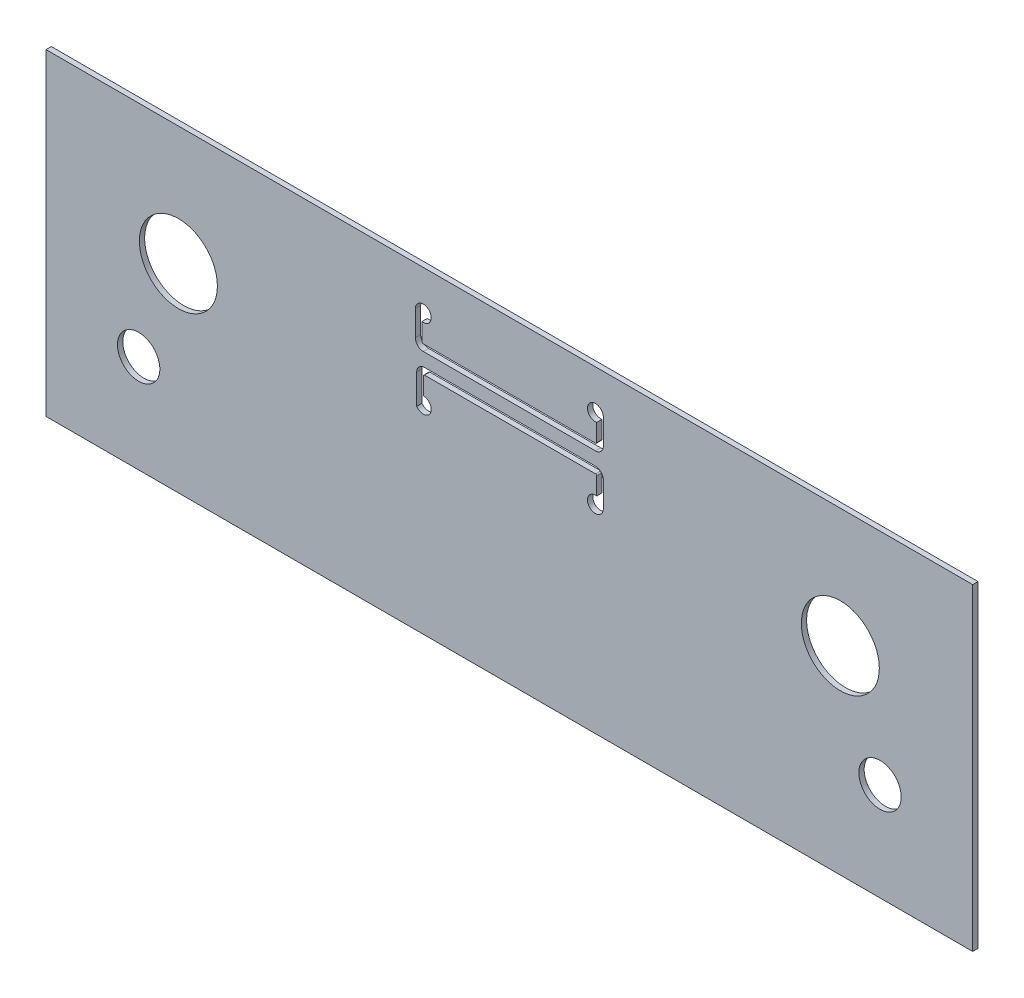
ISO-10303-21;
HEADER;
FILE_DESCRIPTION(('STEP AP214'),'2;1');
FILE_NAME('part.step','',(''),(''),'','','');
FILE_SCHEMA(('AUTOMOTIVE_DESIGN { 1 0 10303 214 1 1 1 1 }'));
ENDSEC;
DATA;
#1=APPLICATION_CONTEXT('core data for automotive mechanical design processes');
#2=APPLICATION_PROTOCOL_DEFINITION('international standard','automotive_design',2000,#1);
#3=PRODUCT_CONTEXT('',#1,'mechanical');
#4=PRODUCT('Part','Part','',(#3));
#5=PRODUCT_RELATED_PRODUCT_CATEGORY('part','',(#4));
#6=PRODUCT_DEFINITION_FORMATION('','',#4);
#7=PRODUCT_DEFINITION_CONTEXT('part definition',#1,'design');
#8=PRODUCT_DEFINITION('design','',#6,#7);
#9=PRODUCT_DEFINITION_SHAPE('','',#8);
#10=(LENGTH_UNIT() NAMED_UNIT(*) SI_UNIT(.MILLI.,.METRE.));
#11=(NAMED_UNIT(*) PLANE_ANGLE_UNIT() SI_UNIT($,.RADIAN.));
#12=(NAMED_UNIT(*) SI_UNIT($,.STERADIAN.) SOLID_ANGLE_UNIT());
#13=UNCERTAINTY_MEASURE_WITH_UNIT(LENGTH_MEASURE(1.E-05),#10,'distance_accuracy_value','');
#14=(GEOMETRIC_REPRESENTATION_CONTEXT(3) GLOBAL_UNCERTAINTY_ASSIGNED_CONTEXT((#13)) GLOBAL_UNIT_ASSIGNED_CONTEXT((#10,
#11,#12)) REPRESENTATION_CONTEXT('',''));
#15=CARTESIAN_POINT('',(0.,0.,0.));
#16=DIRECTION('',(0.,0.,1.));
#17=DIRECTION('',(1.,0.,0.));
#18=AXIS2_PLACEMENT_3D('',#15,#16,#17);
#19=CARTESIAN_POINT('',(0.,0.,0.2));
#20=DIRECTION('',(0.,0.,-1.));
#21=DIRECTION('',(-1.,0.,0.));
#22=AXIS2_PLACEMENT_3D('',#19,#20,#21);
#23=PLANE('',#22);
#24=CARTESIAN_POINT('',(30.,-4.5,0.2));
#25=DIRECTION('',(0.,0.,1.));
#26=DIRECTION('',(1.,0.,0.));
#27=AXIS2_PLACEMENT_3D('',#24,#25,#26);
#28=CIRCLE('',#27,1.4732);
#29=CARTESIAN_POINT('',(31.4732,-4.5,0.2));
#30=VERTEX_POINT('',#29);
#31=EDGE_CURVE('E266',#30,#30,#28,.T.);
#32=ORIENTED_EDGE('',*,*,#31,.F.);
#33=EDGE_LOOP('',(#32));
#34=FACE_BOUND('',#33,.T.);
#35=CARTESIAN_POINT('',(14.25,-4.5,0.2));
#36=DIRECTION('',(0.,0.,1.));
#37=DIRECTION('',(1.,0.,0.));
#38=AXIS2_PLACEMENT_3D('',#35,#36,#37);
#39=CIRCLE('',#38,0.3);
#40=CARTESIAN_POINT('',(14.,-4.66583123951777,0.2));
#41=VERTEX_POINT('',#40);
#42=CARTESIAN_POINT('',(14.25,-4.2,0.2));
#43=VERTEX_POINT('',#42);
#44=EDGE_CURVE('E316',#41,#43,#39,.T.);
#45=ORIENTED_EDGE('',*,*,#44,.F.);
#46=DIRECTION('',(0.,-1.,0.));
#47=VECTOR('',#46,1.);
#48=CARTESIAN_POINT('',(14.,-3.55,0.2));
#49=LINE('',#48,#47);
#50=CARTESIAN_POINT('',(14.,-3.55,0.2));
#51=VERTEX_POINT('',#50);
#52=EDGE_CURVE('E340',#51,#41,#49,.T.);
#53=ORIENTED_EDGE('',*,*,#52,.F.);
#54=CARTESIAN_POINT('',(14.3,-3.55,0.2));
#55=DIRECTION('',(0.,0.,1.));
#56=DIRECTION('',(1.,0.,0.));
#57=AXIS2_PLACEMENT_3D('',#54,#55,#56);
#58=CIRCLE('',#57,0.299999999999999);
#59=CARTESIAN_POINT('',(14.3,-3.25,0.2));
#60=VERTEX_POINT('',#59);
#61=EDGE_CURVE('E337',#60,#51,#58,.T.);
#62=ORIENTED_EDGE('',*,*,#61,.F.);
#63=DIRECTION('',(-1.,0.,0.));
#64=VECTOR('',#63,1.);
#65=CARTESIAN_POINT('',(20.75,-3.25,0.2));
#66=LINE('',#65,#64);
#67=CARTESIAN_POINT('',(20.75,-3.25,0.2));
#68=VERTEX_POINT('',#67);
#69=EDGE_CURVE('E335',#68,#60,#66,.T.);
#70=ORIENTED_EDGE('',*,*,#69,.F.);
#71=CARTESIAN_POINT('',(20.75,-3.55,0.2));
#72=DIRECTION('',(0.,0.,1.));
#73=DIRECTION('',(1.,0.,0.));
#74=AXIS2_PLACEMENT_3D('',#71,#72,#73);
#75=CIRCLE('',#74,0.300000000000001);
#76=CARTESIAN_POINT('',(21.05,-3.55,0.2));
#77=VERTEX_POINT('',#76);
#78=EDGE_CURVE('E333',#77,#68,#75,.T.);
#79=ORIENTED_EDGE('',*,*,#78,.F.);
#80=DIRECTION('',(0.,1.,0.));
#81=VECTOR('',#80,1.);
#82=CARTESIAN_POINT('',(21.05,-4.5,0.2));
#83=LINE('',#82,#81);
#84=CARTESIAN_POINT('',(21.05,-4.5,0.2));
#85=VERTEX_POINT('',#84);
#86=EDGE_CURVE('E331',#85,#77,#83,.T.);
#87=ORIENTED_EDGE('',*,*,#86,.F.);
#88=CARTESIAN_POINT('',(20.75,-4.5,0.2));
#89=DIRECTION('',(0.,0.,1.));
#90=DIRECTION('',(1.,0.,0.));
#91=AXIS2_PLACEMENT_3D('',#88,#89,#90);
#92=CIRCLE('',#91,0.300000000000001);
#93=CARTESIAN_POINT('',(20.8,-4.20419601084502,0.2));
#94=VERTEX_POINT('',#93);
#95=EDGE_CURVE('E329',#94,#85,#92,.T.);
#96=ORIENTED_EDGE('',*,*,#95,.F.);
#97=DIRECTION('',(0.,-1.,0.));
#98=VECTOR('',#97,1.);
#99=CARTESIAN_POINT('',(20.8,-3.55,0.2));
#100=LINE('',#99,#98);
#101=CARTESIAN_POINT('',(20.8,-3.55,0.2));
#102=VERTEX_POINT('',#101);
#103=EDGE_CURVE('E327',#102,#94,#100,.T.);
#104=ORIENTED_EDGE('',*,*,#103,.F.);
#105=CARTESIAN_POINT('',(20.75,-3.55,0.2));
#106=DIRECTION('',(0.,0.,-1.));
#107=DIRECTION('',(-1.,0.,0.));
#108=AXIS2_PLACEMENT_3D('',#105,#106,#107);
#109=CIRCLE('',#108,0.0499999999999982);
#110=CARTESIAN_POINT('',(20.75,-3.5,0.2));
#111=VERTEX_POINT('',#110);
#112=EDGE_CURVE('E325',#111,#102,#109,.T.);
#113=ORIENTED_EDGE('',*,*,#112,.F.);
#114=DIRECTION('',(1.,0.,0.));
#115=VECTOR('',#114,1.);
#116=CARTESIAN_POINT('',(14.3,-3.5,0.2));
#117=LINE('',#116,#115);
#118=CARTESIAN_POINT('',(14.3,-3.5,0.2));
#119=VERTEX_POINT('',#118);
#120=EDGE_CURVE('E323',#119,#111,#117,.T.);
#121=ORIENTED_EDGE('',*,*,#120,.F.);
#122=CARTESIAN_POINT('',(14.3,-3.55,0.2));
#123=DIRECTION('',(0.,0.,-1.));
#124=DIRECTION('',(-1.,0.,0.));
#125=AXIS2_PLACEMENT_3D('',#122,#123,#124);
#126=CIRCLE('',#125,0.0500000000000006);
#127=CARTESIAN_POINT('',(14.25,-3.55,0.2));
#128=VERTEX_POINT('',#127);
#129=EDGE_CURVE('E321',#128,#119,#126,.T.);
#130=ORIENTED_EDGE('',*,*,#129,.F.);
#131=DIRECTION('',(0.,1.,0.));
#132=VECTOR('',#131,1.);
#133=CARTESIAN_POINT('',(14.25,-4.2,0.2));
#134=LINE('',#133,#132);
#135=EDGE_CURVE('E318',#43,#128,#134,.T.);
#136=ORIENTED_EDGE('',*,*,#135,.F.);
#137=EDGE_LOOP('',(#45,#53,#62,#70,#79,#87,#96,#104,#113,#121,#130,#136));
#138=FACE_BOUND('',#137,.T.);
#139=CARTESIAN_POINT('',(3.5,-8.3,0.2));
#140=DIRECTION('',(0.,0.,1.));
#141=DIRECTION('',(1.,0.,0.));
#142=AXIS2_PLACEMENT_3D('',#139,#140,#141);
#143=CIRCLE('',#142,0.800099999999999);
#144=CARTESIAN_POINT('',(4.3001,-8.3,0.2));
#145=VERTEX_POINT('',#144);
#146=EDGE_CURVE('E409',#145,#145,#143,.T.);
#147=ORIENTED_EDGE('',*,*,#146,.F.);
#148=EDGE_LOOP('',(#147));
#149=FACE_BOUND('',#148,.T.);
#150=DIRECTION('',(0.,-1.,0.));
#151=VECTOR('',#150,1.);
#152=CARTESIAN_POINT('',(0.,-12.,0.2));
#153=LINE('',#152,#151);
#154=CARTESIAN_POINT('',(0.,0.,0.2));
#155=VERTEX_POINT('',#154);
#156=CARTESIAN_POINT('',(0.,-12.,0.2));
#157=VERTEX_POINT('',#156);
#158=EDGE_CURVE('E415',#155,#157,#153,.T.);
#159=ORIENTED_EDGE('',*,*,#158,.T.);
#160=DIRECTION('',(1.,0.,0.));
#161=VECTOR('',#160,1.);
#162=CARTESIAN_POINT('',(35.,-12.,0.2));
#163=LINE('',#162,#161);
#164=CARTESIAN_POINT('',(35.,-12.,0.2));
#165=VERTEX_POINT('',#164);
#166=EDGE_CURVE('E418',#157,#165,#163,.T.);
#167=ORIENTED_EDGE('',*,*,#166,.T.);
#168=DIRECTION('',(0.,1.,0.));
#169=VECTOR('',#168,1.);
#170=CARTESIAN_POINT('',(35.,0.,0.2));
#171=LINE('',#170,#169);
#172=CARTESIAN_POINT('',(35.,0.,0.2));
#173=VERTEX_POINT('',#172);
#174=EDGE_CURVE('E421',#165,#173,#171,.T.);
#175=ORIENTED_EDGE('',*,*,#174,.T.);
#176=DIRECTION('',(-1.,0.,0.));
#177=VECTOR('',#176,1.);
#178=CARTESIAN_POINT('',(0.,0.,0.2));
#179=LINE('',#178,#177);
#180=EDGE_CURVE('E423',#173,#155,#179,.T.);
#181=ORIENTED_EDGE('',*,*,#180,.T.);
#182=EDGE_LOOP('',(#159,#167,#175,#181));
#183=FACE_BOUND('',#182,.T.);
#184=CARTESIAN_POINT('',(5.,-4.5,0.2));
#185=DIRECTION('',(0.,0.,1.));
#186=DIRECTION('',(1.,0.,0.));
#187=AXIS2_PLACEMENT_3D('',#184,#185,#186);
#188=CIRCLE('',#187,1.4732);
#189=CARTESIAN_POINT('',(6.4732,-4.5,0.2));
#190=VERTEX_POINT('',#189);
#191=EDGE_CURVE('E403',#190,#190,#188,.T.);
#192=ORIENTED_EDGE('',*,*,#191,.F.);
#193=EDGE_LOOP('',(#192));
#194=FACE_BOUND('',#193,.T.);
#195=CARTESIAN_POINT('',(14.25,-2.45,0.2));
#196=DIRECTION('',(0.,0.,-1.));
#197=DIRECTION('',(1.,0.,0.));
#198=AXIS2_PLACEMENT_3D('',#195,#196,#197);
#199=CIRCLE('',#198,0.0499999999999997);
#200=CARTESIAN_POINT('',(14.25,-2.5,0.2));
#201=VERTEX_POINT('',#200);
#202=CARTESIAN_POINT('',(14.2,-2.45,0.2));
#203=VERTEX_POINT('',#202);
#204=EDGE_CURVE('E220',#201,#203,#199,.T.);
#205=ORIENTED_EDGE('',*,*,#204,.F.);
#206=DIRECTION('',(-1.,0.,0.));
#207=VECTOR('',#206,1.);
#208=CARTESIAN_POINT('',(14.25,-2.5,0.2));
#209=LINE('',#208,#207);
#210=CARTESIAN_POINT('',(20.75,-2.5,0.2));
#211=VERTEX_POINT('',#210);
#212=EDGE_CURVE('E263',#211,#201,#209,.T.);
#213=ORIENTED_EDGE('',*,*,#212,.F.);
#214=CARTESIAN_POINT('',(20.75,-2.45,0.2));
#215=DIRECTION('',(0.,0.,-1.));
#216=DIRECTION('',(1.,0.,0.));
#217=AXIS2_PLACEMENT_3D('',#214,#215,#216);
#218=CIRCLE('',#217,0.0499999999999988);
#219=CARTESIAN_POINT('',(20.8,-2.45,0.2));
#220=VERTEX_POINT('',#219);
#221=EDGE_CURVE('E261',#220,#211,#218,.T.);
#222=ORIENTED_EDGE('',*,*,#221,.F.);
#223=DIRECTION('',(0.,-1.,0.));
#224=VECTOR('',#223,1.);
#225=CARTESIAN_POINT('',(20.8,-2.45,0.2));
#226=LINE('',#225,#224);
#227=CARTESIAN_POINT('',(20.8,-1.79580398915498,0.2));
#228=VERTEX_POINT('',#227);
#229=EDGE_CURVE('E259',#228,#220,#226,.T.);
#230=ORIENTED_EDGE('',*,*,#229,.F.);
#231=CARTESIAN_POINT('',(20.75,-1.5,0.2));
#232=DIRECTION('',(0.,0.,1.));
#233=DIRECTION('',(1.,0.,0.));
#234=AXIS2_PLACEMENT_3D('',#231,#232,#233);
#235=CIRCLE('',#234,0.300000000000001);
#236=CARTESIAN_POINT('',(21.05,-1.5,0.2));
#237=VERTEX_POINT('',#236);
#238=EDGE_CURVE('E257',#237,#228,#235,.T.);
#239=ORIENTED_EDGE('',*,*,#238,.F.);
#240=DIRECTION('',(0.,1.,0.));
#241=VECTOR('',#240,1.);
#242=CARTESIAN_POINT('',(21.05,-2.45,0.2));
#243=LINE('',#242,#241);
#244=CARTESIAN_POINT('',(21.05,-2.45,0.2));
#245=VERTEX_POINT('',#244);
#246=EDGE_CURVE('E255',#245,#237,#243,.T.);
#247=ORIENTED_EDGE('',*,*,#246,.F.);
#248=CARTESIAN_POINT('',(20.75,-2.45,0.2));
#249=DIRECTION('',(0.,0.,1.));
#250=DIRECTION('',(1.,0.,0.));
#251=AXIS2_PLACEMENT_3D('',#248,#249,#250);
#252=CIRCLE('',#251,0.299999999999999);
#253=CARTESIAN_POINT('',(20.75,-2.75,0.2));
#254=VERTEX_POINT('',#253);
#255=EDGE_CURVE('E253',#254,#245,#252,.T.);
#256=ORIENTED_EDGE('',*,*,#255,.F.);
#257=DIRECTION('',(1.,0.,0.));
#258=VECTOR('',#257,1.);
#259=CARTESIAN_POINT('',(14.25,-2.75,0.2));
#260=LINE('',#259,#258);
#261=CARTESIAN_POINT('',(14.25,-2.75,0.2));
#262=VERTEX_POINT('',#261);
#263=EDGE_CURVE('E251',#262,#254,#260,.T.);
#264=ORIENTED_EDGE('',*,*,#263,.F.);
#265=CARTESIAN_POINT('',(14.25,-2.45,0.2));
#266=DIRECTION('',(0.,0.,1.));
#267=DIRECTION('',(1.,0.,0.));
#268=AXIS2_PLACEMENT_3D('',#265,#266,#267);
#269=CIRCLE('',#268,0.3);
#270=CARTESIAN_POINT('',(13.95,-2.45,0.2));
#271=VERTEX_POINT('',#270);
#272=EDGE_CURVE('E249',#271,#262,#269,.T.);
#273=ORIENTED_EDGE('',*,*,#272,.F.);
#274=DIRECTION('',(0.,-1.,0.));
#275=VECTOR('',#274,1.);
#276=CARTESIAN_POINT('',(13.95,-1.5,0.2));
#277=LINE('',#276,#275);
#278=CARTESIAN_POINT('',(13.95,-1.5,0.2));
#279=VERTEX_POINT('',#278);
#280=EDGE_CURVE('E244',#279,#271,#277,.T.);
#281=ORIENTED_EDGE('',*,*,#280,.F.);
#282=CARTESIAN_POINT('',(14.25,-1.5,0.2));
#283=DIRECTION('',(0.,0.,1.));
#284=DIRECTION('',(1.,0.,0.));
#285=AXIS2_PLACEMENT_3D('',#282,#283,#284);
#286=CIRCLE('',#285,0.300000000000001);
#287=CARTESIAN_POINT('',(14.2,-1.79580398915498,0.2));
#288=VERTEX_POINT('',#287);
#289=EDGE_CURVE('E242',#288,#279,#286,.T.);
#290=ORIENTED_EDGE('',*,*,#289,.F.);
#291=DIRECTION('',(0.,1.,0.));
#292=VECTOR('',#291,1.);
#293=CARTESIAN_POINT('',(14.2,-1.79580398915498,0.2));
#294=LINE('',#293,#292);
#295=EDGE_CURVE('E228',#203,#288,#294,.T.);
#296=ORIENTED_EDGE('',*,*,#295,.F.);
#297=EDGE_LOOP('',(#205,#213,#222,#230,#239,#247,#256,#264,#273,#281,#290,#296));
#298=FACE_BOUND('',#297,.T.);
#299=CARTESIAN_POINT('',(31.5,-8.3,0.2));
#300=DIRECTION('',(0.,0.,1.));
#301=DIRECTION('',(1.,0.,0.));
#302=AXIS2_PLACEMENT_3D('',#299,#300,#301);
#303=CIRCLE('',#302,0.800100000000007);
#304=CARTESIAN_POINT('',(32.3001,-8.3,0.2));
#305=VERTEX_POINT('',#304);
#306=EDGE_CURVE('E602',#305,#305,#303,.T.);
#307=ORIENTED_EDGE('',*,*,#306,.F.);
#308=EDGE_LOOP('',(#307));
#309=FACE_BOUND('',#308,.T.);
#310=ADVANCED_FACE('F35',(#34,#138,#149,#183,#194,#298,#309),#23,.F.);
#311=CARTESIAN_POINT('',(0.,0.,0.));
#312=DIRECTION('',(0.,0.,-1.));
#313=DIRECTION('',(-1.,0.,0.));
#314=AXIS2_PLACEMENT_3D('',#311,#312,#313);
#315=PLANE('',#314);
#316=CARTESIAN_POINT('',(30.,-4.5,0.));
#317=DIRECTION('',(0.,0.,1.));
#318=DIRECTION('',(1.,0.,0.));
#319=AXIS2_PLACEMENT_3D('',#316,#317,#318);
#320=CIRCLE('',#319,1.4732);
#321=CARTESIAN_POINT('',(31.4732,-4.5,0.));
#322=VERTEX_POINT('',#321);
#323=EDGE_CURVE('E608',#322,#322,#320,.T.);
#324=ORIENTED_EDGE('',*,*,#323,.T.);
#325=EDGE_LOOP('',(#324));
#326=FACE_BOUND('',#325,.T.);
#327=DIRECTION('',(0.,-1.,0.));
#328=VECTOR('',#327,1.);
#329=CARTESIAN_POINT('',(14.,-3.55,0.));
#330=LINE('',#329,#328);
#331=CARTESIAN_POINT('',(14.,-3.55,0.));
#332=VERTEX_POINT('',#331);
#333=CARTESIAN_POINT('',(14.,-4.66583123951777,0.));
#334=VERTEX_POINT('',#333);
#335=EDGE_CURVE('E319',#332,#334,#330,.T.);
#336=ORIENTED_EDGE('',*,*,#335,.T.);
#337=CARTESIAN_POINT('',(14.25,-4.5,0.));
#338=DIRECTION('',(0.,0.,1.));
#339=DIRECTION('',(1.,0.,0.));
#340=AXIS2_PLACEMENT_3D('',#337,#338,#339);
#341=CIRCLE('',#340,0.3);
#342=CARTESIAN_POINT('',(14.25,-4.2,0.));
#343=VERTEX_POINT('',#342);
#344=EDGE_CURVE('E236',#334,#343,#341,.T.);
#345=ORIENTED_EDGE('',*,*,#344,.T.);
#346=DIRECTION('',(0.,1.,0.));
#347=VECTOR('',#346,1.);
#348=CARTESIAN_POINT('',(14.25,-4.2,0.));
#349=LINE('',#348,#347);
#350=CARTESIAN_POINT('',(14.25,-3.55,0.));
#351=VERTEX_POINT('',#350);
#352=EDGE_CURVE('E345',#343,#351,#349,.T.);
#353=ORIENTED_EDGE('',*,*,#352,.T.);
#354=CARTESIAN_POINT('',(14.3,-3.55,0.));
#355=DIRECTION('',(0.,0.,-1.));
#356=DIRECTION('',(-1.,0.,0.));
#357=AXIS2_PLACEMENT_3D('',#354,#355,#356);
#358=CIRCLE('',#357,0.0500000000000006);
#359=CARTESIAN_POINT('',(14.3,-3.5,0.));
#360=VERTEX_POINT('',#359);
#361=EDGE_CURVE('E348',#351,#360,#358,.T.);
#362=ORIENTED_EDGE('',*,*,#361,.T.);
#363=DIRECTION('',(1.,0.,0.));
#364=VECTOR('',#363,1.);
#365=CARTESIAN_POINT('',(14.3,-3.5,0.));
#366=LINE('',#365,#364);
#367=CARTESIAN_POINT('',(20.75,-3.5,0.));
#368=VERTEX_POINT('',#367);
#369=EDGE_CURVE('E351',#360,#368,#366,.T.);
#370=ORIENTED_EDGE('',*,*,#369,.T.);
#371=CARTESIAN_POINT('',(20.75,-3.55,0.));
#372=DIRECTION('',(0.,0.,-1.));
#373=DIRECTION('',(-1.,0.,0.));
#374=AXIS2_PLACEMENT_3D('',#371,#372,#373);
#375=CIRCLE('',#374,0.0499999999999982);
#376=CARTESIAN_POINT('',(20.8,-3.55,0.));
#377=VERTEX_POINT('',#376);
#378=EDGE_CURVE('E354',#368,#377,#375,.T.);
#379=ORIENTED_EDGE('',*,*,#378,.T.);
#380=DIRECTION('',(0.,-1.,0.));
#381=VECTOR('',#380,1.);
#382=CARTESIAN_POINT('',(20.8,-3.55,0.));
#383=LINE('',#382,#381);
#384=CARTESIAN_POINT('',(20.8,-4.20419601084502,0.));
#385=VERTEX_POINT('',#384);
#386=EDGE_CURVE('E357',#377,#385,#383,.T.);
#387=ORIENTED_EDGE('',*,*,#386,.T.);
#388=CARTESIAN_POINT('',(20.75,-4.5,0.));
#389=DIRECTION('',(0.,0.,1.));
#390=DIRECTION('',(1.,0.,0.));
#391=AXIS2_PLACEMENT_3D('',#388,#389,#390);
#392=CIRCLE('',#391,0.300000000000001);
#393=CARTESIAN_POINT('',(21.05,-4.5,0.));
#394=VERTEX_POINT('',#393);
#395=EDGE_CURVE('E360',#385,#394,#392,.T.);
#396=ORIENTED_EDGE('',*,*,#395,.T.);
#397=DIRECTION('',(0.,1.,0.));
#398=VECTOR('',#397,1.);
#399=CARTESIAN_POINT('',(21.05,-4.5,0.));
#400=LINE('',#399,#398);
#401=CARTESIAN_POINT('',(21.05,-3.55,0.));
#402=VERTEX_POINT('',#401);
#403=EDGE_CURVE('E363',#394,#402,#400,.T.);
#404=ORIENTED_EDGE('',*,*,#403,.T.);
#405=CARTESIAN_POINT('',(20.75,-3.55,0.));
#406=DIRECTION('',(0.,0.,1.));
#407=DIRECTION('',(1.,0.,0.));
#408=AXIS2_PLACEMENT_3D('',#405,#406,#407);
#409=CIRCLE('',#408,0.300000000000001);
#410=CARTESIAN_POINT('',(20.75,-3.25,0.));
#411=VERTEX_POINT('',#410);
#412=EDGE_CURVE('E366',#402,#411,#409,.T.);
#413=ORIENTED_EDGE('',*,*,#412,.T.);
#414=DIRECTION('',(-1.,0.,0.));
#415=VECTOR('',#414,1.);
#416=CARTESIAN_POINT('',(20.75,-3.25,0.));
#417=LINE('',#416,#415);
#418=CARTESIAN_POINT('',(14.3,-3.25,0.));
#419=VERTEX_POINT('',#418);
#420=EDGE_CURVE('E369',#411,#419,#417,.T.);
#421=ORIENTED_EDGE('',*,*,#420,.T.);
#422=CARTESIAN_POINT('',(14.3,-3.55,0.));
#423=DIRECTION('',(0.,0.,1.));
#424=DIRECTION('',(1.,0.,0.));
#425=AXIS2_PLACEMENT_3D('',#422,#423,#424);
#426=CIRCLE('',#425,0.299999999999999);
#427=EDGE_CURVE('E372',#419,#332,#426,.T.);
#428=ORIENTED_EDGE('',*,*,#427,.T.);
#429=EDGE_LOOP('',(#336,#345,#353,#362,#370,#379,#387,#396,#404,#413,#421,#428));
#430=FACE_BOUND('',#429,.T.);
#431=CARTESIAN_POINT('',(3.5,-8.3,0.));
#432=DIRECTION('',(0.,0.,1.));
#433=DIRECTION('',(1.,0.,0.));
#434=AXIS2_PLACEMENT_3D('',#431,#432,#433);
#435=CIRCLE('',#434,0.800099999999999);
#436=CARTESIAN_POINT('',(4.3001,-8.3,0.));
#437=VERTEX_POINT('',#436);
#438=EDGE_CURVE('E406',#437,#437,#435,.T.);
#439=ORIENTED_EDGE('',*,*,#438,.T.);
#440=EDGE_LOOP('',(#439));
#441=FACE_BOUND('',#440,.T.);
#442=DIRECTION('',(0.,-1.,0.));
#443=VECTOR('',#442,1.);
#444=CARTESIAN_POINT('',(0.,-12.,0.));
#445=LINE('',#444,#443);
#446=CARTESIAN_POINT('',(0.,0.,0.));
#447=VERTEX_POINT('',#446);
#448=CARTESIAN_POINT('',(0.,-12.,0.));
#449=VERTEX_POINT('',#448);
#450=EDGE_CURVE('E412',#447,#449,#445,.T.);
#451=ORIENTED_EDGE('',*,*,#450,.F.);
#452=DIRECTION('',(-1.,0.,0.));
#453=VECTOR('',#452,1.);
#454=CARTESIAN_POINT('',(0.,0.,0.));
#455=LINE('',#454,#453);
#456=CARTESIAN_POINT('',(35.,0.,0.));
#457=VERTEX_POINT('',#456);
#458=EDGE_CURVE('E419',#457,#447,#455,.T.);
#459=ORIENTED_EDGE('',*,*,#458,.F.);
#460=DIRECTION('',(0.,1.,0.));
#461=VECTOR('',#460,1.);
#462=CARTESIAN_POINT('',(35.,0.,0.));
#463=LINE('',#462,#461);
#464=CARTESIAN_POINT('',(35.,-12.,0.));
#465=VERTEX_POINT('',#464);
#466=EDGE_CURVE('E430',#465,#457,#463,.T.);
#467=ORIENTED_EDGE('',*,*,#466,.F.);
#468=DIRECTION('',(1.,0.,0.));
#469=VECTOR('',#468,1.);
#470=CARTESIAN_POINT('',(35.,-12.,0.));
#471=LINE('',#470,#469);
#472=EDGE_CURVE('E428',#449,#465,#471,.T.);
#473=ORIENTED_EDGE('',*,*,#472,.F.);
#474=EDGE_LOOP('',(#451,#459,#467,#473));
#475=FACE_BOUND('',#474,.T.);
#476=CARTESIAN_POINT('',(5.,-4.5,0.));
#477=DIRECTION('',(0.,0.,1.));
#478=DIRECTION('',(1.,0.,0.));
#479=AXIS2_PLACEMENT_3D('',#476,#477,#478);
#480=CIRCLE('',#479,1.4732);
#481=CARTESIAN_POINT('',(6.4732,-4.5,0.));
#482=VERTEX_POINT('',#481);
#483=EDGE_CURVE('E402',#482,#482,#480,.T.);
#484=ORIENTED_EDGE('',*,*,#483,.T.);
#485=EDGE_LOOP('',(#484));
#486=FACE_BOUND('',#485,.T.);
#487=DIRECTION('',(-1.,0.,0.));
#488=VECTOR('',#487,1.);
#489=CARTESIAN_POINT('',(14.25,-2.5,0.));
#490=LINE('',#489,#488);
#491=CARTESIAN_POINT('',(20.75,-2.5,0.));
#492=VERTEX_POINT('',#491);
#493=CARTESIAN_POINT('',(14.25,-2.5,0.));
#494=VERTEX_POINT('',#493);
#495=EDGE_CURVE('E229',#492,#494,#490,.T.);
#496=ORIENTED_EDGE('',*,*,#495,.T.);
#497=CARTESIAN_POINT('',(14.25,-2.45,0.));
#498=DIRECTION('',(0.,0.,-1.));
#499=DIRECTION('',(1.,0.,0.));
#500=AXIS2_PLACEMENT_3D('',#497,#498,#499);
#501=CIRCLE('',#500,0.0499999999999997);
#502=CARTESIAN_POINT('',(14.2,-2.45,0.));
#503=VERTEX_POINT('',#502);
#504=EDGE_CURVE('E58',#494,#503,#501,.T.);
#505=ORIENTED_EDGE('',*,*,#504,.T.);
#506=DIRECTION('',(0.,1.,0.));
#507=VECTOR('',#506,1.);
#508=CARTESIAN_POINT('',(14.2,-1.79580398915498,0.));
#509=LINE('',#508,#507);
#510=CARTESIAN_POINT('',(14.2,-1.79580398915498,0.));
#511=VERTEX_POINT('',#510);
#512=EDGE_CURVE('E235',#503,#511,#509,.T.);
#513=ORIENTED_EDGE('',*,*,#512,.T.);
#514=CARTESIAN_POINT('',(14.25,-1.5,0.));
#515=DIRECTION('',(0.,0.,1.));
#516=DIRECTION('',(1.,0.,0.));
#517=AXIS2_PLACEMENT_3D('',#514,#515,#516);
#518=CIRCLE('',#517,0.300000000000001);
#519=CARTESIAN_POINT('',(13.95,-1.5,0.));
#520=VERTEX_POINT('',#519);
#521=EDGE_CURVE('E268',#511,#520,#518,.T.);
#522=ORIENTED_EDGE('',*,*,#521,.T.);
#523=DIRECTION('',(0.,-1.,0.));
#524=VECTOR('',#523,1.);
#525=CARTESIAN_POINT('',(13.95,-1.5,0.));
#526=LINE('',#525,#524);
#527=CARTESIAN_POINT('',(13.95,-2.45,0.));
#528=VERTEX_POINT('',#527);
#529=EDGE_CURVE('E271',#520,#528,#526,.T.);
#530=ORIENTED_EDGE('',*,*,#529,.T.);
#531=CARTESIAN_POINT('',(14.25,-2.45,0.));
#532=DIRECTION('',(0.,0.,1.));
#533=DIRECTION('',(1.,0.,0.));
#534=AXIS2_PLACEMENT_3D('',#531,#532,#533);
#535=CIRCLE('',#534,0.3);
#536=CARTESIAN_POINT('',(14.25,-2.75,0.));
#537=VERTEX_POINT('',#536);
#538=EDGE_CURVE('E274',#528,#537,#535,.T.);
#539=ORIENTED_EDGE('',*,*,#538,.T.);
#540=DIRECTION('',(1.,0.,0.));
#541=VECTOR('',#540,1.);
#542=CARTESIAN_POINT('',(14.25,-2.75,0.));
#543=LINE('',#542,#541);
#544=CARTESIAN_POINT('',(20.75,-2.75,0.));
#545=VERTEX_POINT('',#544);
#546=EDGE_CURVE('E277',#537,#545,#543,.T.);
#547=ORIENTED_EDGE('',*,*,#546,.T.);
#548=CARTESIAN_POINT('',(20.75,-2.45,0.));
#549=DIRECTION('',(0.,0.,1.));
#550=DIRECTION('',(1.,0.,0.));
#551=AXIS2_PLACEMENT_3D('',#548,#549,#550);
#552=CIRCLE('',#551,0.299999999999999);
#553=CARTESIAN_POINT('',(21.05,-2.45,0.));
#554=VERTEX_POINT('',#553);
#555=EDGE_CURVE('E280',#545,#554,#552,.T.);
#556=ORIENTED_EDGE('',*,*,#555,.T.);
#557=DIRECTION('',(0.,1.,0.));
#558=VECTOR('',#557,1.);
#559=CARTESIAN_POINT('',(21.05,-2.45,0.));
#560=LINE('',#559,#558);
#561=CARTESIAN_POINT('',(21.05,-1.5,0.));
#562=VERTEX_POINT('',#561);
#563=EDGE_CURVE('E283',#554,#562,#560,.T.);
#564=ORIENTED_EDGE('',*,*,#563,.T.);
#565=CARTESIAN_POINT('',(20.75,-1.5,0.));
#566=DIRECTION('',(0.,0.,1.));
#567=DIRECTION('',(1.,0.,0.));
#568=AXIS2_PLACEMENT_3D('',#565,#566,#567);
#569=CIRCLE('',#568,0.300000000000001);
#570=CARTESIAN_POINT('',(20.8,-1.79580398915498,0.));
#571=VERTEX_POINT('',#570);
#572=EDGE_CURVE('E286',#562,#571,#569,.T.);
#573=ORIENTED_EDGE('',*,*,#572,.T.);
#574=DIRECTION('',(0.,-1.,0.));
#575=VECTOR('',#574,1.);
#576=CARTESIAN_POINT('',(20.8,-2.45,0.));
#577=LINE('',#576,#575);
#578=CARTESIAN_POINT('',(20.8,-2.45,0.));
#579=VERTEX_POINT('',#578);
#580=EDGE_CURVE('E289',#571,#579,#577,.T.);
#581=ORIENTED_EDGE('',*,*,#580,.T.);
#582=CARTESIAN_POINT('',(20.75,-2.45,0.));
#583=DIRECTION('',(0.,0.,-1.));
#584=DIRECTION('',(1.,0.,0.));
#585=AXIS2_PLACEMENT_3D('',#582,#583,#584);
#586=CIRCLE('',#585,0.0499999999999988);
#587=EDGE_CURVE('E292',#579,#492,#586,.T.);
#588=ORIENTED_EDGE('',*,*,#587,.T.);
#589=EDGE_LOOP('',(#496,#505,#513,#522,#530,#539,#547,#556,#564,#573,#581,#588));
#590=FACE_BOUND('',#589,.T.);
#591=CARTESIAN_POINT('',(31.5,-8.3,0.));
#592=DIRECTION('',(0.,0.,1.));
#593=DIRECTION('',(1.,0.,0.));
#594=AXIS2_PLACEMENT_3D('',#591,#592,#593);
#595=CIRCLE('',#594,0.800100000000007);
#596=CARTESIAN_POINT('',(32.3001,-8.3,0.));
#597=VERTEX_POINT('',#596);
#598=EDGE_CURVE('E605',#597,#597,#595,.T.);
#599=ORIENTED_EDGE('',*,*,#598,.T.);
#600=EDGE_LOOP('',(#599));
#601=FACE_BOUND('',#600,.T.);
#602=ADVANCED_FACE('F448',(#326,#430,#441,#475,#486,#590,#601),#315,.T.);
#603=CARTESIAN_POINT('',(0.,-12.,0.2));
#604=DIRECTION('',(1.,0.,0.));
#605=DIRECTION('',(0.,0.,-1.));
#606=AXIS2_PLACEMENT_3D('',#603,#604,#605);
#607=PLANE('',#606);
#608=ORIENTED_EDGE('',*,*,#450,.T.);
#609=DIRECTION('',(0.,0.,-1.));
#610=VECTOR('',#609,1.);
#611=CARTESIAN_POINT('',(0.,-12.,0.2));
#612=LINE('',#611,#610);
#613=EDGE_CURVE('E11',#157,#449,#612,.T.);
#614=ORIENTED_EDGE('',*,*,#613,.F.);
#615=ORIENTED_EDGE('',*,*,#158,.F.);
#616=DIRECTION('',(0.,0.,-1.));
#617=VECTOR('',#616,1.);
#618=CARTESIAN_POINT('',(0.,0.,0.2));
#619=LINE('',#618,#617);
#620=EDGE_CURVE('E425',#155,#447,#619,.T.);
#621=ORIENTED_EDGE('',*,*,#620,.T.);
#622=EDGE_LOOP('',(#608,#614,#615,#621));
#623=FACE_BOUND('',#622,.T.);
#624=ADVANCED_FACE('F37',(#623),#607,.F.);
#625=CARTESIAN_POINT('',(35.,-12.,0.2));
#626=DIRECTION('',(0.,1.,0.));
#627=DIRECTION('',(-1.,0.,0.));
#628=AXIS2_PLACEMENT_3D('',#625,#626,#627);
#629=PLANE('',#628);
#630=ORIENTED_EDGE('',*,*,#472,.T.);
#631=DIRECTION('',(0.,0.,-1.));
#632=VECTOR('',#631,1.);
#633=CARTESIAN_POINT('',(35.,-12.,0.2));
#634=LINE('',#633,#632);
#635=EDGE_CURVE('E43',#165,#465,#634,.T.);
#636=ORIENTED_EDGE('',*,*,#635,.F.);
#637=ORIENTED_EDGE('',*,*,#166,.F.);
#638=ORIENTED_EDGE('',*,*,#613,.T.);
#639=EDGE_LOOP('',(#630,#636,#637,#638));
#640=FACE_BOUND('',#639,.T.);
#641=ADVANCED_FACE('F459',(#640),#629,.F.);
#642=CARTESIAN_POINT('',(35.,0.,0.2));
#643=DIRECTION('',(-1.,0.,0.));
#644=DIRECTION('',(0.,-1.,0.));
#645=AXIS2_PLACEMENT_3D('',#642,#643,#644);
#646=PLANE('',#645);
#647=ORIENTED_EDGE('',*,*,#466,.T.);
#648=DIRECTION('',(0.,0.,-1.));
#649=VECTOR('',#648,1.);
#650=CARTESIAN_POINT('',(35.,0.,0.2));
#651=LINE('',#650,#649);
#652=EDGE_CURVE('E435',#173,#457,#651,.T.);
#653=ORIENTED_EDGE('',*,*,#652,.F.);
#654=ORIENTED_EDGE('',*,*,#174,.F.);
#655=ORIENTED_EDGE('',*,*,#635,.T.);
#656=EDGE_LOOP('',(#647,#653,#654,#655));
#657=FACE_BOUND('',#656,.T.);
#658=ADVANCED_FACE('F442',(#657),#646,.F.);
#659=CARTESIAN_POINT('',(0.,0.,0.2));
#660=DIRECTION('',(0.,-1.,0.));
#661=DIRECTION('',(0.,0.,-1.));
#662=AXIS2_PLACEMENT_3D('',#659,#660,#661);
#663=PLANE('',#662);
#664=ORIENTED_EDGE('',*,*,#458,.T.);
#665=ORIENTED_EDGE('',*,*,#620,.F.);
#666=ORIENTED_EDGE('',*,*,#180,.F.);
#667=ORIENTED_EDGE('',*,*,#652,.T.);
#668=EDGE_LOOP('',(#664,#665,#666,#667));
#669=FACE_BOUND('',#668,.T.);
#670=ADVANCED_FACE('F452',(#669),#663,.F.);
#671=CARTESIAN_POINT('',(3.5,-8.3,0.2));
#672=DIRECTION('',(0.,0.,-1.));
#673=DIRECTION('',(-1.,0.,0.));
#674=AXIS2_PLACEMENT_3D('',#671,#672,#673);
#675=CYLINDRICAL_SURFACE('',#674,0.800099999999999);
#676=ORIENTED_EDGE('',*,*,#146,.T.);
#677=EDGE_LOOP('',(#676));
#678=FACE_BOUND('',#677,.T.);
#679=ORIENTED_EDGE('',*,*,#438,.F.);
#680=EDGE_LOOP('',(#679));
#681=FACE_BOUND('',#680,.T.);
#682=ADVANCED_FACE('F477',(#678,#681),#675,.F.);
#683=CARTESIAN_POINT('',(5.,-4.5,0.2));
#684=DIRECTION('',(0.,0.,-1.));
#685=DIRECTION('',(-1.,0.,0.));
#686=AXIS2_PLACEMENT_3D('',#683,#684,#685);
#687=CYLINDRICAL_SURFACE('',#686,1.4732);
#688=ORIENTED_EDGE('',*,*,#191,.T.);
#689=EDGE_LOOP('',(#688));
#690=FACE_BOUND('',#689,.T.);
#691=ORIENTED_EDGE('',*,*,#483,.F.);
#692=EDGE_LOOP('',(#691));
#693=FACE_BOUND('',#692,.T.);
#694=ADVANCED_FACE('F484',(#690,#693),#687,.F.);
#695=CARTESIAN_POINT('',(14.25,-4.5,0.2));
#696=DIRECTION('',(0.,0.,-1.));
#697=DIRECTION('',(-1.,0.,0.));
#698=AXIS2_PLACEMENT_3D('',#695,#696,#697);
#699=CYLINDRICAL_SURFACE('',#698,0.3);
#700=ORIENTED_EDGE('',*,*,#344,.F.);
#701=DIRECTION('',(0.,0.,-1.));
#702=VECTOR('',#701,1.);
#703=CARTESIAN_POINT('',(14.,-4.66583123951777,0.2));
#704=LINE('',#703,#702);
#705=EDGE_CURVE('E342',#41,#334,#704,.T.);
#706=ORIENTED_EDGE('',*,*,#705,.F.);
#707=ORIENTED_EDGE('',*,*,#44,.T.);
#708=DIRECTION('',(0.,0.,-1.));
#709=VECTOR('',#708,1.);
#710=CARTESIAN_POINT('',(14.25,-4.2,0.2));
#711=LINE('',#710,#709);
#712=EDGE_CURVE('E399',#43,#343,#711,.T.);
#713=ORIENTED_EDGE('',*,*,#712,.T.);
#714=EDGE_LOOP('',(#700,#706,#707,#713));
#715=FACE_BOUND('',#714,.T.);
#716=ADVANCED_FACE('F489',(#715),#699,.F.);
#717=CARTESIAN_POINT('',(14.25,-4.2,0.2));
#718=DIRECTION('',(-1.,0.,0.));
#719=DIRECTION('',(0.,-1.,0.));
#720=AXIS2_PLACEMENT_3D('',#717,#718,#719);
#721=PLANE('',#720);
#722=ORIENTED_EDGE('',*,*,#352,.F.);
#723=ORIENTED_EDGE('',*,*,#712,.F.);
#724=ORIENTED_EDGE('',*,*,#135,.T.);
#725=DIRECTION('',(0.,0.,-1.));
#726=VECTOR('',#725,1.);
#727=CARTESIAN_POINT('',(14.25,-3.55,0.2));
#728=LINE('',#727,#726);
#729=EDGE_CURVE('E397',#128,#351,#728,.T.);
#730=ORIENTED_EDGE('',*,*,#729,.T.);
#731=EDGE_LOOP('',(#722,#723,#724,#730));
#732=FACE_BOUND('',#731,.T.);
#733=ADVANCED_FACE('F499',(#732),#721,.T.);
#734=CARTESIAN_POINT('',(14.3,-3.55,0.2));
#735=DIRECTION('',(0.,0.,-1.));
#736=DIRECTION('',(-1.,0.,0.));
#737=AXIS2_PLACEMENT_3D('',#734,#735,#736);
#738=CYLINDRICAL_SURFACE('',#737,0.0500000000000006);
#739=ORIENTED_EDGE('',*,*,#361,.F.);
#740=ORIENTED_EDGE('',*,*,#729,.F.);
#741=ORIENTED_EDGE('',*,*,#129,.T.);
#742=DIRECTION('',(0.,0.,-1.));
#743=VECTOR('',#742,1.);
#744=CARTESIAN_POINT('',(14.3,-3.5,0.2));
#745=LINE('',#744,#743);
#746=EDGE_CURVE('E395',#119,#360,#745,.T.);
#747=ORIENTED_EDGE('',*,*,#746,.T.);
#748=EDGE_LOOP('',(#739,#740,#741,#747));
#749=FACE_BOUND('',#748,.T.);
#750=ADVANCED_FACE('F506',(#749),#738,.T.);
#751=CARTESIAN_POINT('',(14.3,-3.5,0.2));
#752=DIRECTION('',(0.,1.,0.));
#753=DIRECTION('',(-1.,0.,0.));
#754=AXIS2_PLACEMENT_3D('',#751,#752,#753);
#755=PLANE('',#754);
#756=ORIENTED_EDGE('',*,*,#369,.F.);
#757=ORIENTED_EDGE('',*,*,#746,.F.);
#758=ORIENTED_EDGE('',*,*,#120,.T.);
#759=DIRECTION('',(0.,0.,-1.));
#760=VECTOR('',#759,1.);
#761=CARTESIAN_POINT('',(20.75,-3.5,0.2));
#762=LINE('',#761,#760);
#763=EDGE_CURVE('E393',#111,#368,#762,.T.);
#764=ORIENTED_EDGE('',*,*,#763,.T.);
#765=EDGE_LOOP('',(#756,#757,#758,#764));
#766=FACE_BOUND('',#765,.T.);
#767=ADVANCED_FACE('F510',(#766),#755,.T.);
#768=CARTESIAN_POINT('',(20.75,-3.55,0.2));
#769=DIRECTION('',(0.,0.,-1.));
#770=DIRECTION('',(-1.,0.,0.));
#771=AXIS2_PLACEMENT_3D('',#768,#769,#770);
#772=CYLINDRICAL_SURFACE('',#771,0.0499999999999982);
#773=ORIENTED_EDGE('',*,*,#378,.F.);
#774=ORIENTED_EDGE('',*,*,#763,.F.);
#775=ORIENTED_EDGE('',*,*,#112,.T.);
#776=DIRECTION('',(0.,0.,-1.));
#777=VECTOR('',#776,1.);
#778=CARTESIAN_POINT('',(20.8,-3.55,0.2));
#779=LINE('',#778,#777);
#780=EDGE_CURVE('E391',#102,#377,#779,.T.);
#781=ORIENTED_EDGE('',*,*,#780,.T.);
#782=EDGE_LOOP('',(#773,#774,#775,#781));
#783=FACE_BOUND('',#782,.T.);
#784=ADVANCED_FACE('F514',(#783),#772,.T.);
#785=CARTESIAN_POINT('',(20.8,-3.55,0.2));
#786=DIRECTION('',(1.,0.,0.));
#787=DIRECTION('',(0.,1.,0.));
#788=AXIS2_PLACEMENT_3D('',#785,#786,#787);
#789=PLANE('',#788);
#790=ORIENTED_EDGE('',*,*,#386,.F.);
#791=ORIENTED_EDGE('',*,*,#780,.F.);
#792=ORIENTED_EDGE('',*,*,#103,.T.);
#793=DIRECTION('',(0.,0.,-1.));
#794=VECTOR('',#793,1.);
#795=CARTESIAN_POINT('',(20.8,-4.20419601084502,0.2));
#796=LINE('',#795,#794);
#797=EDGE_CURVE('E389',#94,#385,#796,.T.);
#798=ORIENTED_EDGE('',*,*,#797,.T.);
#799=EDGE_LOOP('',(#790,#791,#792,#798));
#800=FACE_BOUND('',#799,.T.);
#801=ADVANCED_FACE('F518',(#800),#789,.T.);
#802=CARTESIAN_POINT('',(20.75,-4.5,0.2));
#803=DIRECTION('',(0.,0.,-1.));
#804=DIRECTION('',(-1.,0.,0.));
#805=AXIS2_PLACEMENT_3D('',#802,#803,#804);
#806=CYLINDRICAL_SURFACE('',#805,0.300000000000001);
#807=ORIENTED_EDGE('',*,*,#395,.F.);
#808=ORIENTED_EDGE('',*,*,#797,.F.);
#809=ORIENTED_EDGE('',*,*,#95,.T.);
#810=DIRECTION('',(0.,0.,-1.));
#811=VECTOR('',#810,1.);
#812=CARTESIAN_POINT('',(21.05,-4.5,0.2));
#813=LINE('',#812,#811);
#814=EDGE_CURVE('E387',#85,#394,#813,.T.);
#815=ORIENTED_EDGE('',*,*,#814,.T.);
#816=EDGE_LOOP('',(#807,#808,#809,#815));
#817=FACE_BOUND('',#816,.T.);
#818=ADVANCED_FACE('F522',(#817),#806,.F.);
#819=CARTESIAN_POINT('',(21.05,-4.5,0.2));
#820=DIRECTION('',(-1.,0.,0.));
#821=DIRECTION('',(0.,0.,1.));
#822=AXIS2_PLACEMENT_3D('',#819,#820,#821);
#823=PLANE('',#822);
#824=ORIENTED_EDGE('',*,*,#403,.F.);
#825=ORIENTED_EDGE('',*,*,#814,.F.);
#826=ORIENTED_EDGE('',*,*,#86,.T.);
#827=DIRECTION('',(0.,0.,-1.));
#828=VECTOR('',#827,1.);
#829=CARTESIAN_POINT('',(21.05,-3.55,0.2));
#830=LINE('',#829,#828);
#831=EDGE_CURVE('E385',#77,#402,#830,.T.);
#832=ORIENTED_EDGE('',*,*,#831,.T.);
#833=EDGE_LOOP('',(#824,#825,#826,#832));
#834=FACE_BOUND('',#833,.T.);
#835=ADVANCED_FACE('F526',(#834),#823,.T.);
#836=CARTESIAN_POINT('',(20.75,-3.55,0.2));
#837=DIRECTION('',(0.,0.,-1.));
#838=DIRECTION('',(-1.,0.,0.));
#839=AXIS2_PLACEMENT_3D('',#836,#837,#838);
#840=CYLINDRICAL_SURFACE('',#839,0.300000000000001);
#841=ORIENTED_EDGE('',*,*,#412,.F.);
#842=ORIENTED_EDGE('',*,*,#831,.F.);
#843=ORIENTED_EDGE('',*,*,#78,.T.);
#844=DIRECTION('',(0.,0.,-1.));
#845=VECTOR('',#844,1.);
#846=CARTESIAN_POINT('',(20.75,-3.25,0.2));
#847=LINE('',#846,#845);
#848=EDGE_CURVE('E383',#68,#411,#847,.T.);
#849=ORIENTED_EDGE('',*,*,#848,.T.);
#850=EDGE_LOOP('',(#841,#842,#843,#849));
#851=FACE_BOUND('',#850,.T.);
#852=ADVANCED_FACE('F530',(#851),#840,.F.);
#853=CARTESIAN_POINT('',(20.75,-3.25,0.2));
#854=DIRECTION('',(0.,-1.,0.));
#855=DIRECTION('',(1.,0.,0.));
#856=AXIS2_PLACEMENT_3D('',#853,#854,#855);
#857=PLANE('',#856);
#858=ORIENTED_EDGE('',*,*,#420,.F.);
#859=ORIENTED_EDGE('',*,*,#848,.F.);
#860=ORIENTED_EDGE('',*,*,#69,.T.);
#861=DIRECTION('',(0.,0.,-1.));
#862=VECTOR('',#861,1.);
#863=CARTESIAN_POINT('',(14.3,-3.25,0.2));
#864=LINE('',#863,#862);
#865=EDGE_CURVE('E381',#60,#419,#864,.T.);
#866=ORIENTED_EDGE('',*,*,#865,.T.);
#867=EDGE_LOOP('',(#858,#859,#860,#866));
#868=FACE_BOUND('',#867,.T.);
#869=ADVANCED_FACE('F534',(#868),#857,.T.);
#870=CARTESIAN_POINT('',(14.3,-3.55,0.2));
#871=DIRECTION('',(0.,0.,-1.));
#872=DIRECTION('',(-1.,0.,0.));
#873=AXIS2_PLACEMENT_3D('',#870,#871,#872);
#874=CYLINDRICAL_SURFACE('',#873,0.299999999999999);
#875=ORIENTED_EDGE('',*,*,#427,.F.);
#876=ORIENTED_EDGE('',*,*,#865,.F.);
#877=ORIENTED_EDGE('',*,*,#61,.T.);
#878=DIRECTION('',(0.,0.,-1.));
#879=VECTOR('',#878,1.);
#880=CARTESIAN_POINT('',(14.,-3.55,0.2));
#881=LINE('',#880,#879);
#882=EDGE_CURVE('E379',#51,#332,#881,.T.);
#883=ORIENTED_EDGE('',*,*,#882,.T.);
#884=EDGE_LOOP('',(#875,#876,#877,#883));
#885=FACE_BOUND('',#884,.T.);
#886=ADVANCED_FACE('F538',(#885),#874,.F.);
#887=CARTESIAN_POINT('',(14.,-3.55,0.2));
#888=DIRECTION('',(1.,0.,0.));
#889=DIRECTION('',(0.,1.,0.));
#890=AXIS2_PLACEMENT_3D('',#887,#888,#889);
#891=PLANE('',#890);
#892=ORIENTED_EDGE('',*,*,#335,.F.);
#893=ORIENTED_EDGE('',*,*,#882,.F.);
#894=ORIENTED_EDGE('',*,*,#52,.T.);
#895=ORIENTED_EDGE('',*,*,#705,.T.);
#896=EDGE_LOOP('',(#892,#893,#894,#895));
#897=FACE_BOUND('',#896,.T.);
#898=ADVANCED_FACE('F542',(#897),#891,.T.);
#899=CARTESIAN_POINT('',(14.25,-2.45,0.2));
#900=DIRECTION('',(0.,0.,-1.));
#901=DIRECTION('',(-1.,0.,0.));
#902=AXIS2_PLACEMENT_3D('',#899,#900,#901);
#903=CYLINDRICAL_SURFACE('',#902,0.0499999999999997);
#904=ORIENTED_EDGE('',*,*,#504,.F.);
#905=DIRECTION('',(0.,0.,-1.));
#906=VECTOR('',#905,1.);
#907=CARTESIAN_POINT('',(14.25,-2.5,0.2));
#908=LINE('',#907,#906);
#909=EDGE_CURVE('E224',#201,#494,#908,.T.);
#910=ORIENTED_EDGE('',*,*,#909,.F.);
#911=ORIENTED_EDGE('',*,*,#204,.T.);
#912=DIRECTION('',(0.,0.,-1.));
#913=VECTOR('',#912,1.);
#914=CARTESIAN_POINT('',(14.2,-2.45,0.2));
#915=LINE('',#914,#913);
#916=EDGE_CURVE('E223',#203,#503,#915,.T.);
#917=ORIENTED_EDGE('',*,*,#916,.T.);
#918=EDGE_LOOP('',(#904,#910,#911,#917));
#919=FACE_BOUND('',#918,.T.);
#920=ADVANCED_FACE('F222',(#919),#903,.T.);
#921=CARTESIAN_POINT('',(14.2,-1.79580398915498,0.2));
#922=DIRECTION('',(-1.,0.,0.));
#923=DIRECTION('',(0.,-1.,0.));
#924=AXIS2_PLACEMENT_3D('',#921,#922,#923);
#925=PLANE('',#924);
#926=ORIENTED_EDGE('',*,*,#512,.F.);
#927=ORIENTED_EDGE('',*,*,#916,.F.);
#928=ORIENTED_EDGE('',*,*,#295,.T.);
#929=DIRECTION('',(0.,0.,-1.));
#930=VECTOR('',#929,1.);
#931=CARTESIAN_POINT('',(14.2,-1.79580398915498,0.2));
#932=LINE('',#931,#930);
#933=EDGE_CURVE('E237',#288,#511,#932,.T.);
#934=ORIENTED_EDGE('',*,*,#933,.T.);
#935=EDGE_LOOP('',(#926,#927,#928,#934));
#936=FACE_BOUND('',#935,.T.);
#937=ADVANCED_FACE('F232',(#936),#925,.T.);
#938=CARTESIAN_POINT('',(14.25,-1.5,0.2));
#939=DIRECTION('',(0.,0.,-1.));
#940=DIRECTION('',(-1.,0.,0.));
#941=AXIS2_PLACEMENT_3D('',#938,#939,#940);
#942=CYLINDRICAL_SURFACE('',#941,0.300000000000001);
#943=ORIENTED_EDGE('',*,*,#521,.F.);
#944=ORIENTED_EDGE('',*,*,#933,.F.);
#945=ORIENTED_EDGE('',*,*,#289,.T.);
#946=DIRECTION('',(0.,0.,-1.));
#947=VECTOR('',#946,1.);
#948=CARTESIAN_POINT('',(13.95,-1.5,0.2));
#949=LINE('',#948,#947);
#950=EDGE_CURVE('E313',#279,#520,#949,.T.);
#951=ORIENTED_EDGE('',*,*,#950,.T.);
#952=EDGE_LOOP('',(#943,#944,#945,#951));
#953=FACE_BOUND('',#952,.T.);
#954=ADVANCED_FACE('F551',(#953),#942,.F.);
#955=CARTESIAN_POINT('',(13.95,-1.5,0.2));
#956=DIRECTION('',(1.,0.,0.));
#957=DIRECTION('',(0.,0.,-1.));
#958=AXIS2_PLACEMENT_3D('',#955,#956,#957);
#959=PLANE('',#958);
#960=ORIENTED_EDGE('',*,*,#529,.F.);
#961=ORIENTED_EDGE('',*,*,#950,.F.);
#962=ORIENTED_EDGE('',*,*,#280,.T.);
#963=DIRECTION('',(0.,0.,-1.));
#964=VECTOR('',#963,1.);
#965=CARTESIAN_POINT('',(13.95,-2.45,0.2));
#966=LINE('',#965,#964);
#967=EDGE_CURVE('E311',#271,#528,#966,.T.);
#968=ORIENTED_EDGE('',*,*,#967,.T.);
#969=EDGE_LOOP('',(#960,#961,#962,#968));
#970=FACE_BOUND('',#969,.T.);
#971=ADVANCED_FACE('F554',(#970),#959,.T.);
#972=CARTESIAN_POINT('',(14.25,-2.45,0.2));
#973=DIRECTION('',(0.,0.,-1.));
#974=DIRECTION('',(-1.,0.,0.));
#975=AXIS2_PLACEMENT_3D('',#972,#973,#974);
#976=CYLINDRICAL_SURFACE('',#975,0.3);
#977=ORIENTED_EDGE('',*,*,#538,.F.);
#978=ORIENTED_EDGE('',*,*,#967,.F.);
#979=ORIENTED_EDGE('',*,*,#272,.T.);
#980=DIRECTION('',(0.,0.,-1.));
#981=VECTOR('',#980,1.);
#982=CARTESIAN_POINT('',(14.25,-2.75,0.2));
#983=LINE('',#982,#981);
#984=EDGE_CURVE('E309',#262,#537,#983,.T.);
#985=ORIENTED_EDGE('',*,*,#984,.T.);
#986=EDGE_LOOP('',(#977,#978,#979,#985));
#987=FACE_BOUND('',#986,.T.);
#988=ADVANCED_FACE('F558',(#987),#976,.F.);
#989=CARTESIAN_POINT('',(14.25,-2.75,0.2));
#990=DIRECTION('',(0.,1.,0.));
#991=DIRECTION('',(-1.,0.,0.));
#992=AXIS2_PLACEMENT_3D('',#989,#990,#991);
#993=PLANE('',#992);
#994=ORIENTED_EDGE('',*,*,#546,.F.);
#995=ORIENTED_EDGE('',*,*,#984,.F.);
#996=ORIENTED_EDGE('',*,*,#263,.T.);
#997=DIRECTION('',(0.,0.,-1.));
#998=VECTOR('',#997,1.);
#999=CARTESIAN_POINT('',(20.75,-2.75,0.2));
#1000=LINE('',#999,#998);
#1001=EDGE_CURVE('E307',#254,#545,#1000,.T.);
#1002=ORIENTED_EDGE('',*,*,#1001,.T.);
#1003=EDGE_LOOP('',(#994,#995,#996,#1002));
#1004=FACE_BOUND('',#1003,.T.);
#1005=ADVANCED_FACE('F562',(#1004),#993,.T.);
#1006=CARTESIAN_POINT('',(20.75,-2.45,0.2));
#1007=DIRECTION('',(0.,0.,-1.));
#1008=DIRECTION('',(-1.,0.,0.));
#1009=AXIS2_PLACEMENT_3D('',#1006,#1007,#1008);
#1010=CYLINDRICAL_SURFACE('',#1009,0.299999999999999);
#1011=ORIENTED_EDGE('',*,*,#555,.F.);
#1012=ORIENTED_EDGE('',*,*,#1001,.F.);
#1013=ORIENTED_EDGE('',*,*,#255,.T.);
#1014=DIRECTION('',(0.,0.,-1.));
#1015=VECTOR('',#1014,1.);
#1016=CARTESIAN_POINT('',(21.05,-2.45,0.2));
#1017=LINE('',#1016,#1015);
#1018=EDGE_CURVE('E305',#245,#554,#1017,.T.);
#1019=ORIENTED_EDGE('',*,*,#1018,.T.);
#1020=EDGE_LOOP('',(#1011,#1012,#1013,#1019));
#1021=FACE_BOUND('',#1020,.T.);
#1022=ADVANCED_FACE('F566',(#1021),#1010,.F.);
#1023=CARTESIAN_POINT('',(21.05,-2.45,0.2));
#1024=DIRECTION('',(-1.,0.,0.));
#1025=DIRECTION('',(0.,0.,1.));
#1026=AXIS2_PLACEMENT_3D('',#1023,#1024,#1025);
#1027=PLANE('',#1026);
#1028=ORIENTED_EDGE('',*,*,#563,.F.);
#1029=ORIENTED_EDGE('',*,*,#1018,.F.);
#1030=ORIENTED_EDGE('',*,*,#246,.T.);
#1031=DIRECTION('',(0.,0.,-1.));
#1032=VECTOR('',#1031,1.);
#1033=CARTESIAN_POINT('',(21.05,-1.5,0.2));
#1034=LINE('',#1033,#1032);
#1035=EDGE_CURVE('E303',#237,#562,#1034,.T.);
#1036=ORIENTED_EDGE('',*,*,#1035,.T.);
#1037=EDGE_LOOP('',(#1028,#1029,#1030,#1036));
#1038=FACE_BOUND('',#1037,.T.);
#1039=ADVANCED_FACE('F570',(#1038),#1027,.T.);
#1040=CARTESIAN_POINT('',(20.75,-1.5,0.2));
#1041=DIRECTION('',(0.,0.,-1.));
#1042=DIRECTION('',(-1.,0.,0.));
#1043=AXIS2_PLACEMENT_3D('',#1040,#1041,#1042);
#1044=CYLINDRICAL_SURFACE('',#1043,0.300000000000001);
#1045=ORIENTED_EDGE('',*,*,#572,.F.);
#1046=ORIENTED_EDGE('',*,*,#1035,.F.);
#1047=ORIENTED_EDGE('',*,*,#238,.T.);
#1048=DIRECTION('',(0.,0.,-1.));
#1049=VECTOR('',#1048,1.);
#1050=CARTESIAN_POINT('',(20.8,-1.79580398915498,0.2));
#1051=LINE('',#1050,#1049);
#1052=EDGE_CURVE('E301',#228,#571,#1051,.T.);
#1053=ORIENTED_EDGE('',*,*,#1052,.T.);
#1054=EDGE_LOOP('',(#1045,#1046,#1047,#1053));
#1055=FACE_BOUND('',#1054,.T.);
#1056=ADVANCED_FACE('F574',(#1055),#1044,.F.);
#1057=CARTESIAN_POINT('',(20.8,-2.45,0.2));
#1058=DIRECTION('',(1.,0.,0.));
#1059=DIRECTION('',(0.,0.,-1.));
#1060=AXIS2_PLACEMENT_3D('',#1057,#1058,#1059);
#1061=PLANE('',#1060);
#1062=ORIENTED_EDGE('',*,*,#580,.F.);
#1063=ORIENTED_EDGE('',*,*,#1052,.F.);
#1064=ORIENTED_EDGE('',*,*,#229,.T.);
#1065=DIRECTION('',(0.,0.,-1.));
#1066=VECTOR('',#1065,1.);
#1067=CARTESIAN_POINT('',(20.8,-2.45,0.2));
#1068=LINE('',#1067,#1066);
#1069=EDGE_CURVE('E299',#220,#579,#1068,.T.);
#1070=ORIENTED_EDGE('',*,*,#1069,.T.);
#1071=EDGE_LOOP('',(#1062,#1063,#1064,#1070));
#1072=FACE_BOUND('',#1071,.T.);
#1073=ADVANCED_FACE('F578',(#1072),#1061,.T.);
#1074=CARTESIAN_POINT('',(20.75,-2.45,0.2));
#1075=DIRECTION('',(0.,0.,-1.));
#1076=DIRECTION('',(-1.,0.,0.));
#1077=AXIS2_PLACEMENT_3D('',#1074,#1075,#1076);
#1078=CYLINDRICAL_SURFACE('',#1077,0.0499999999999988);
#1079=ORIENTED_EDGE('',*,*,#587,.F.);
#1080=ORIENTED_EDGE('',*,*,#1069,.F.);
#1081=ORIENTED_EDGE('',*,*,#221,.T.);
#1082=DIRECTION('',(0.,0.,-1.));
#1083=VECTOR('',#1082,1.);
#1084=CARTESIAN_POINT('',(20.75,-2.5,0.2));
#1085=LINE('',#1084,#1083);
#1086=EDGE_CURVE('E50',#211,#492,#1085,.T.);
#1087=ORIENTED_EDGE('',*,*,#1086,.T.);
#1088=EDGE_LOOP('',(#1079,#1080,#1081,#1087));
#1089=FACE_BOUND('',#1088,.T.);
#1090=ADVANCED_FACE('F582',(#1089),#1078,.T.);
#1091=CARTESIAN_POINT('',(14.25,-2.5,0.2));
#1092=DIRECTION('',(0.,-1.,0.));
#1093=DIRECTION('',(1.,0.,0.));
#1094=AXIS2_PLACEMENT_3D('',#1091,#1092,#1093);
#1095=PLANE('',#1094);
#1096=ORIENTED_EDGE('',*,*,#495,.F.);
#1097=ORIENTED_EDGE('',*,*,#1086,.F.);
#1098=ORIENTED_EDGE('',*,*,#212,.T.);
#1099=ORIENTED_EDGE('',*,*,#909,.T.);
#1100=EDGE_LOOP('',(#1096,#1097,#1098,#1099));
#1101=FACE_BOUND('',#1100,.T.);
#1102=ADVANCED_FACE('F586',(#1101),#1095,.T.);
#1103=CARTESIAN_POINT('',(30.,-4.5,0.2));
#1104=DIRECTION('',(0.,0.,-1.));
#1105=DIRECTION('',(-1.,0.,0.));
#1106=AXIS2_PLACEMENT_3D('',#1103,#1104,#1105);
#1107=CYLINDRICAL_SURFACE('',#1106,1.4732);
#1108=ORIENTED_EDGE('',*,*,#31,.T.);
#1109=EDGE_LOOP('',(#1108));
#1110=FACE_BOUND('',#1109,.T.);
#1111=ORIENTED_EDGE('',*,*,#323,.F.);
#1112=EDGE_LOOP('',(#1111));
#1113=FACE_BOUND('',#1112,.T.);
#1114=ADVANCED_FACE('F590',(#1110,#1113),#1107,.F.);
#1115=CARTESIAN_POINT('',(31.5,-8.3,0.2));
#1116=DIRECTION('',(0.,0.,-1.));
#1117=DIRECTION('',(-1.,0.,0.));
#1118=AXIS2_PLACEMENT_3D('',#1115,#1116,#1117);
#1119=CYLINDRICAL_SURFACE('',#1118,0.800100000000007);
#1120=ORIENTED_EDGE('',*,*,#306,.T.);
#1121=EDGE_LOOP('',(#1120));
#1122=FACE_BOUND('',#1121,.T.);
#1123=ORIENTED_EDGE('',*,*,#598,.F.);
#1124=EDGE_LOOP('',(#1123));
#1125=FACE_BOUND('',#1124,.T.);
#1126=ADVANCED_FACE('F593',(#1122,#1125),#1119,.F.);
#1127=CLOSED_SHELL('',(#310,#602,#624,#641,#658,#670,#682,#694,#716,#733,#750,#767,#784,#801,
#818,#835,#852,#869,#886,#898,#920,#937,#954,#971,#988,#1005,#1022,#1039,#1056,#1073,#1090,
#1102,#1114,#1126));
#1128=MANIFOLD_SOLID_BREP('B2',#1127);
#1129=ADVANCED_BREP_SHAPE_REPRESENTATION('',(#18,#1128),#14);
#1130=SHAPE_DEFINITION_REPRESENTATION(#9,#1129);
ENDSEC;
END-ISO-10303-21;
